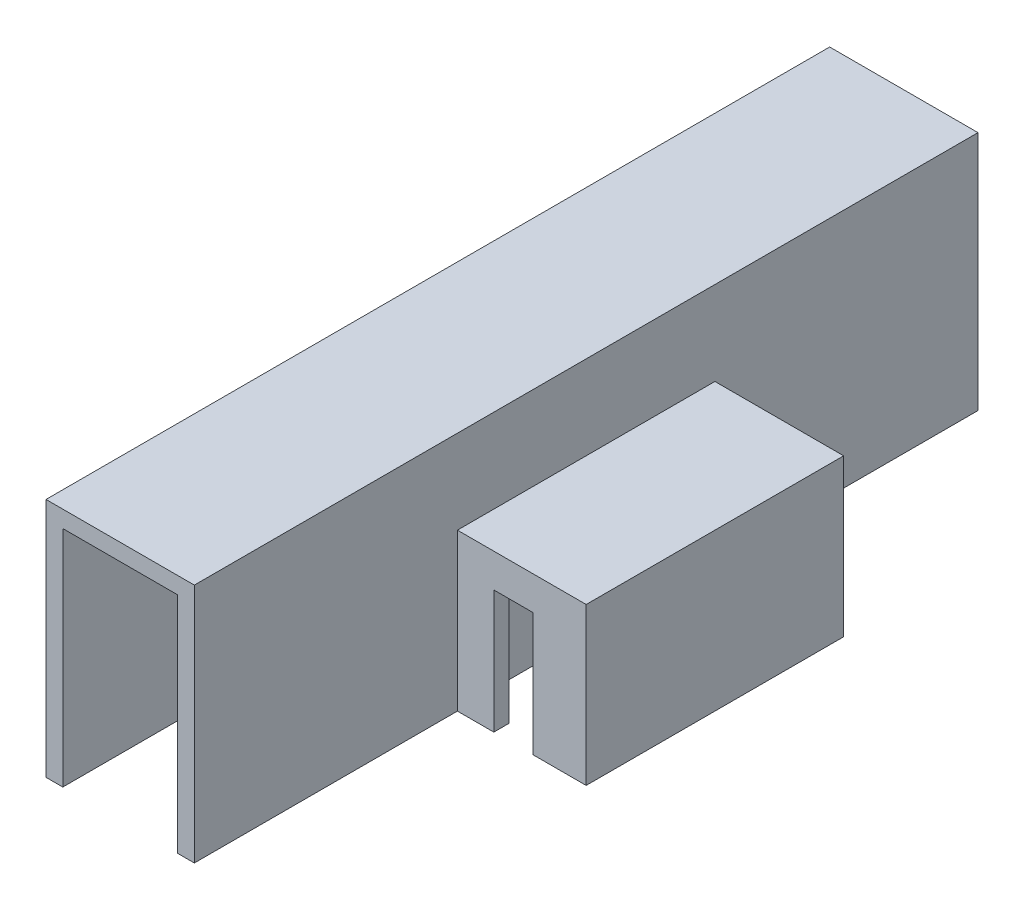
ISO-10303-21;
HEADER;
FILE_DESCRIPTION(('STEP AP214'),'2;1');
FILE_NAME('part.step','',(''),(''),'','','');
FILE_SCHEMA(('AUTOMOTIVE_DESIGN { 1 0 10303 214 1 1 1 1 }'));
ENDSEC;
DATA;
#1=APPLICATION_CONTEXT('core data for automotive mechanical design processes');
#2=APPLICATION_PROTOCOL_DEFINITION('international standard','automotive_design',2000,#1);
#3=PRODUCT_CONTEXT('',#1,'mechanical');
#4=PRODUCT('Part','Part','',(#3));
#5=PRODUCT_RELATED_PRODUCT_CATEGORY('part','',(#4));
#6=PRODUCT_DEFINITION_FORMATION('','',#4);
#7=PRODUCT_DEFINITION_CONTEXT('part definition',#1,'design');
#8=PRODUCT_DEFINITION('design','',#6,#7);
#9=PRODUCT_DEFINITION_SHAPE('','',#8);
#10=(LENGTH_UNIT() NAMED_UNIT(*) SI_UNIT(.MILLI.,.METRE.));
#11=(NAMED_UNIT(*) PLANE_ANGLE_UNIT() SI_UNIT($,.RADIAN.));
#12=(NAMED_UNIT(*) SI_UNIT($,.STERADIAN.) SOLID_ANGLE_UNIT());
#13=UNCERTAINTY_MEASURE_WITH_UNIT(LENGTH_MEASURE(1.E-05),#10,'distance_accuracy_value','');
#14=(GEOMETRIC_REPRESENTATION_CONTEXT(3) GLOBAL_UNCERTAINTY_ASSIGNED_CONTEXT((#13)) GLOBAL_UNIT_ASSIGNED_CONTEXT((#10,
#11,#12)) REPRESENTATION_CONTEXT('',''));
#15=CARTESIAN_POINT('',(0.,0.,0.));
#16=DIRECTION('',(0.,0.,1.));
#17=DIRECTION('',(1.,0.,0.));
#18=AXIS2_PLACEMENT_3D('',#15,#16,#17);
#19=CARTESIAN_POINT('',(-13.,26.,-23.));
#20=DIRECTION('',(0.,0.,1.));
#21=DIRECTION('',(1.,0.,0.));
#22=AXIS2_PLACEMENT_3D('',#19,#20,#21);
#23=PLANE('',#22);
#24=DIRECTION('',(0.,-1.,0.));
#25=VECTOR('',#24,1.);
#26=CARTESIAN_POINT('',(-9.99999999999999,0.,-23.));
#27=LINE('',#26,#25);
#28=CARTESIAN_POINT('',(-9.99999999999999,28.,-23.));
#29=VERTEX_POINT('',#28);
#30=CARTESIAN_POINT('',(-9.99999999999999,0.,-23.));
#31=VERTEX_POINT('',#30);
#32=EDGE_CURVE('E11',#29,#31,#27,.T.);
#33=ORIENTED_EDGE('',*,*,#32,.F.);
#34=DIRECTION('',(-1.,0.,0.));
#35=VECTOR('',#34,1.);
#36=CARTESIAN_POINT('',(-13.,28.,-23.));
#37=LINE('',#36,#35);
#38=CARTESIAN_POINT('',(13.,28.,-23.));
#39=VERTEX_POINT('',#38);
#40=EDGE_CURVE('E310',#39,#29,#37,.T.);
#41=ORIENTED_EDGE('',*,*,#40,.F.);
#42=DIRECTION('',(0.,-1.,0.));
#43=VECTOR('',#42,1.);
#44=CARTESIAN_POINT('',(13.,26.,-23.));
#45=LINE('',#44,#43);
#46=CARTESIAN_POINT('',(13.,0.,-23.));
#47=VERTEX_POINT('',#46);
#48=EDGE_CURVE('E382',#39,#47,#45,.T.);
#49=ORIENTED_EDGE('',*,*,#48,.T.);
#50=DIRECTION('',(-1.,0.,0.));
#51=VECTOR('',#50,1.);
#52=CARTESIAN_POINT('',(-13.,0.,-23.));
#53=LINE('',#52,#51);
#54=EDGE_CURVE('E368',#47,#31,#53,.T.);
#55=ORIENTED_EDGE('',*,*,#54,.T.);
#56=EDGE_LOOP('',(#33,#41,#49,#55));
#57=FACE_BOUND('',#56,.T.);
#58=ADVANCED_FACE('F39',(#57),#23,.F.);
#59=CARTESIAN_POINT('',(-13.,26.,23.));
#60=DIRECTION('',(0.,0.,-1.));
#61=DIRECTION('',(-1.,0.,0.));
#62=AXIS2_PLACEMENT_3D('',#59,#60,#61);
#63=PLANE('',#62);
#64=DIRECTION('',(0.,1.,0.));
#65=VECTOR('',#64,1.);
#66=CARTESIAN_POINT('',(-9.99999999999999,0.,23.));
#67=LINE('',#66,#65);
#68=CARTESIAN_POINT('',(-9.99999999999999,0.,23.));
#69=VERTEX_POINT('',#68);
#70=CARTESIAN_POINT('',(-9.99999999999999,28.,23.));
#71=VERTEX_POINT('',#70);
#72=EDGE_CURVE('E62',#69,#71,#67,.T.);
#73=ORIENTED_EDGE('',*,*,#72,.F.);
#74=DIRECTION('',(1.,0.,0.));
#75=VECTOR('',#74,1.);
#76=CARTESIAN_POINT('',(-13.,0.,23.));
#77=LINE('',#76,#75);
#78=CARTESIAN_POINT('',(-3.5,0.,23.));
#79=VERTEX_POINT('',#78);
#80=EDGE_CURVE('E375',#69,#79,#77,.T.);
#81=ORIENTED_EDGE('',*,*,#80,.T.);
#82=DIRECTION('',(0.,-1.,0.));
#83=VECTOR('',#82,1.);
#84=CARTESIAN_POINT('',(-3.5,22.,23.));
#85=LINE('',#84,#83);
#86=CARTESIAN_POINT('',(-3.5,22.,23.));
#87=VERTEX_POINT('',#86);
#88=EDGE_CURVE('E299',#87,#79,#85,.T.);
#89=ORIENTED_EDGE('',*,*,#88,.F.);
#90=DIRECTION('',(-1.,0.,0.));
#91=VECTOR('',#90,1.);
#92=CARTESIAN_POINT('',(-3.5,22.,23.));
#93=LINE('',#92,#91);
#94=CARTESIAN_POINT('',(3.5,22.,23.));
#95=VERTEX_POINT('',#94);
#96=EDGE_CURVE('E290',#95,#87,#93,.T.);
#97=ORIENTED_EDGE('',*,*,#96,.F.);
#98=DIRECTION('',(0.,-1.,0.));
#99=VECTOR('',#98,1.);
#100=CARTESIAN_POINT('',(3.5,22.,23.));
#101=LINE('',#100,#99);
#102=CARTESIAN_POINT('',(3.5,0.,23.));
#103=VERTEX_POINT('',#102);
#104=EDGE_CURVE('E294',#95,#103,#101,.T.);
#105=ORIENTED_EDGE('',*,*,#104,.T.);
#106=CARTESIAN_POINT('',(13.,0.,23.));
#107=VERTEX_POINT('',#106);
#108=EDGE_CURVE('E374',#103,#107,#77,.T.);
#109=ORIENTED_EDGE('',*,*,#108,.T.);
#110=DIRECTION('',(0.,-1.,0.));
#111=VECTOR('',#110,1.);
#112=CARTESIAN_POINT('',(13.,26.,23.));
#113=LINE('',#112,#111);
#114=CARTESIAN_POINT('',(13.,28.,23.));
#115=VERTEX_POINT('',#114);
#116=EDGE_CURVE('E378',#115,#107,#113,.T.);
#117=ORIENTED_EDGE('',*,*,#116,.F.);
#118=DIRECTION('',(1.,0.,0.));
#119=VECTOR('',#118,1.);
#120=CARTESIAN_POINT('',(-13.,28.,23.));
#121=LINE('',#120,#119);
#122=EDGE_CURVE('E314',#71,#115,#121,.T.);
#123=ORIENTED_EDGE('',*,*,#122,.F.);
#124=EDGE_LOOP('',(#73,#81,#89,#97,#105,#109,#117,#123));
#125=FACE_BOUND('',#124,.T.);
#126=ADVANCED_FACE('F412',(#125),#63,.F.);
#127=CARTESIAN_POINT('',(0.,0.,0.));
#128=DIRECTION('',(0.,1.,0.));
#129=DIRECTION('',(0.,0.,1.));
#130=AXIS2_PLACEMENT_3D('',#127,#128,#129);
#131=PLANE('',#130);
#132=DIRECTION('',(1.,0.,0.));
#133=VECTOR('',#132,1.);
#134=CARTESIAN_POINT('',(-10.25,0.,20.25));
#135=LINE('',#134,#133);
#136=CARTESIAN_POINT('',(-10.25,0.,20.25));
#137=VERTEX_POINT('',#136);
#138=CARTESIAN_POINT('',(-3.5,0.,20.25));
#139=VERTEX_POINT('',#138);
#140=EDGE_CURVE('E323',#137,#139,#135,.T.);
#141=ORIENTED_EDGE('',*,*,#140,.T.);
#142=DIRECTION('',(0.,0.,-1.));
#143=VECTOR('',#142,1.);
#144=CARTESIAN_POINT('',(-3.5,0.,23.));
#145=LINE('',#144,#143);
#146=EDGE_CURVE('E282',#79,#139,#145,.T.);
#147=ORIENTED_EDGE('',*,*,#146,.F.);
#148=ORIENTED_EDGE('',*,*,#80,.F.);
#149=DIRECTION('',(0.,0.,-1.));
#150=VECTOR('',#149,1.);
#151=CARTESIAN_POINT('',(-9.99999999999999,0.,30.));
#152=LINE('',#151,#150);
#153=CARTESIAN_POINT('',(-9.99999999999999,0.,70.));
#154=VERTEX_POINT('',#153);
#155=EDGE_CURVE('E189',#154,#69,#152,.T.);
#156=ORIENTED_EDGE('',*,*,#155,.F.);
#157=DIRECTION('',(1.,0.,0.));
#158=VECTOR('',#157,1.);
#159=CARTESIAN_POINT('',(-9.99999999999999,0.,70.));
#160=LINE('',#159,#158);
#161=CARTESIAN_POINT('',(-13.,0.,70.));
#162=VERTEX_POINT('',#161);
#163=EDGE_CURVE('E237',#162,#154,#160,.T.);
#164=ORIENTED_EDGE('',*,*,#163,.F.);
#165=DIRECTION('',(0.,0.,1.));
#166=VECTOR('',#165,1.);
#167=CARTESIAN_POINT('',(-13.,0.,-23.));
#168=LINE('',#167,#166);
#169=CARTESIAN_POINT('',(-13.,0.,-70.));
#170=VERTEX_POINT('',#169);
#171=EDGE_CURVE('E371',#170,#162,#168,.T.);
#172=ORIENTED_EDGE('',*,*,#171,.F.);
#173=DIRECTION('',(-1.,0.,0.));
#174=VECTOR('',#173,1.);
#175=CARTESIAN_POINT('',(-13.,0.,-70.));
#176=LINE('',#175,#174);
#177=CARTESIAN_POINT('',(-9.99999999999999,0.,-70.));
#178=VERTEX_POINT('',#177);
#179=EDGE_CURVE('E205',#178,#170,#176,.T.);
#180=ORIENTED_EDGE('',*,*,#179,.F.);
#181=DIRECTION('',(0.,0.,1.));
#182=VECTOR('',#181,1.);
#183=CARTESIAN_POINT('',(-9.99999999999999,0.,-30.));
#184=LINE('',#183,#182);
#185=EDGE_CURVE('E272',#178,#31,#184,.T.);
#186=ORIENTED_EDGE('',*,*,#185,.T.);
#187=ORIENTED_EDGE('',*,*,#54,.F.);
#188=DIRECTION('',(0.,0.,-1.));
#189=VECTOR('',#188,1.);
#190=CARTESIAN_POINT('',(13.,0.,-23.));
#191=LINE('',#190,#189);
#192=EDGE_CURVE('E364',#107,#47,#191,.T.);
#193=ORIENTED_EDGE('',*,*,#192,.F.);
#194=ORIENTED_EDGE('',*,*,#108,.F.);
#195=DIRECTION('',(0.,0.,1.));
#196=VECTOR('',#195,1.);
#197=CARTESIAN_POINT('',(3.5,0.,23.));
#198=LINE('',#197,#196);
#199=CARTESIAN_POINT('',(3.5,0.,20.25));
#200=VERTEX_POINT('',#199);
#201=EDGE_CURVE('E287',#200,#103,#198,.T.);
#202=ORIENTED_EDGE('',*,*,#201,.F.);
#203=CARTESIAN_POINT('',(10.25,0.,20.25));
#204=VERTEX_POINT('',#203);
#205=EDGE_CURVE('E347',#200,#204,#135,.T.);
#206=ORIENTED_EDGE('',*,*,#205,.T.);
#207=DIRECTION('',(0.,0.,-1.));
#208=VECTOR('',#207,1.);
#209=CARTESIAN_POINT('',(10.25,0.,-20.25));
#210=LINE('',#209,#208);
#211=CARTESIAN_POINT('',(10.25,0.,-20.25));
#212=VERTEX_POINT('',#211);
#213=EDGE_CURVE('E317',#204,#212,#210,.T.);
#214=ORIENTED_EDGE('',*,*,#213,.T.);
#215=DIRECTION('',(-1.,0.,0.));
#216=VECTOR('',#215,1.);
#217=CARTESIAN_POINT('',(-10.25,0.,-20.25));
#218=LINE('',#217,#216);
#219=CARTESIAN_POINT('',(-10.25,0.,-20.25));
#220=VERTEX_POINT('',#219);
#221=EDGE_CURVE('E339',#212,#220,#218,.T.);
#222=ORIENTED_EDGE('',*,*,#221,.T.);
#223=DIRECTION('',(0.,0.,1.));
#224=VECTOR('',#223,1.);
#225=CARTESIAN_POINT('',(-10.25,0.,-20.25));
#226=LINE('',#225,#224);
#227=EDGE_CURVE('E343',#220,#137,#226,.T.);
#228=ORIENTED_EDGE('',*,*,#227,.T.);
#229=EDGE_LOOP('',(#141,#147,#148,#156,#164,#172,#180,#186,#187,#193,#194,#202,#206,#214,#222,#228));
#230=FACE_BOUND('',#229,.T.);
#231=ADVANCED_FACE('F414',(#230),#131,.F.);
#232=CARTESIAN_POINT('',(13.,26.,-23.));
#233=DIRECTION('',(-1.,0.,0.));
#234=DIRECTION('',(0.,0.,1.));
#235=AXIS2_PLACEMENT_3D('',#232,#233,#234);
#236=PLANE('',#235);
#237=ORIENTED_EDGE('',*,*,#192,.T.);
#238=ORIENTED_EDGE('',*,*,#48,.F.);
#239=DIRECTION('',(0.,0.,-1.));
#240=VECTOR('',#239,1.);
#241=CARTESIAN_POINT('',(13.,28.,-23.));
#242=LINE('',#241,#240);
#243=EDGE_CURVE('E303',#115,#39,#242,.T.);
#244=ORIENTED_EDGE('',*,*,#243,.F.);
#245=ORIENTED_EDGE('',*,*,#116,.T.);
#246=EDGE_LOOP('',(#237,#238,#244,#245));
#247=FACE_BOUND('',#246,.T.);
#248=ADVANCED_FACE('F41',(#247),#236,.F.);
#249=CARTESIAN_POINT('',(-13.,26.,-23.));
#250=DIRECTION('',(1.,0.,0.));
#251=DIRECTION('',(0.,0.,-1.));
#252=AXIS2_PLACEMENT_3D('',#249,#250,#251);
#253=PLANE('',#252);
#254=ORIENTED_EDGE('',*,*,#171,.T.);
#255=DIRECTION('',(0.,-1.,0.));
#256=VECTOR('',#255,1.);
#257=CARTESIAN_POINT('',(-13.,0.,70.));
#258=LINE('',#257,#256);
#259=CARTESIAN_POINT('',(-13.,40.,70.));
#260=VERTEX_POINT('',#259);
#261=EDGE_CURVE('E184',#260,#162,#258,.T.);
#262=ORIENTED_EDGE('',*,*,#261,.F.);
#263=DIRECTION('',(0.,0.,-1.));
#264=VECTOR('',#263,1.);
#265=CARTESIAN_POINT('',(-13.,40.,30.));
#266=LINE('',#265,#264);
#267=CARTESIAN_POINT('',(-13.,40.,-70.));
#268=VERTEX_POINT('',#267);
#269=EDGE_CURVE('E178',#260,#268,#266,.T.);
#270=ORIENTED_EDGE('',*,*,#269,.T.);
#271=DIRECTION('',(0.,1.,0.));
#272=VECTOR('',#271,1.);
#273=CARTESIAN_POINT('',(-13.,40.,-70.));
#274=LINE('',#273,#272);
#275=EDGE_CURVE('E182',#170,#268,#274,.T.);
#276=ORIENTED_EDGE('',*,*,#275,.F.);
#277=EDGE_LOOP('',(#254,#262,#270,#276));
#278=FACE_BOUND('',#277,.T.);
#279=ADVANCED_FACE('F180',(#278),#253,.F.);
#280=CARTESIAN_POINT('',(10.25,26.,-20.25));
#281=DIRECTION('',(-1.,0.,0.));
#282=DIRECTION('',(0.,0.,1.));
#283=AXIS2_PLACEMENT_3D('',#280,#281,#282);
#284=PLANE('',#283);
#285=ORIENTED_EDGE('',*,*,#213,.F.);
#286=DIRECTION('',(0.,-1.,0.));
#287=VECTOR('',#286,1.);
#288=CARTESIAN_POINT('',(10.25,26.,20.25));
#289=LINE('',#288,#287);
#290=CARTESIAN_POINT('',(10.25,26.,20.25));
#291=VERTEX_POINT('',#290);
#292=EDGE_CURVE('E335',#291,#204,#289,.T.);
#293=ORIENTED_EDGE('',*,*,#292,.F.);
#294=DIRECTION('',(0.,0.,-1.));
#295=VECTOR('',#294,1.);
#296=CARTESIAN_POINT('',(10.25,26.,-20.25));
#297=LINE('',#296,#295);
#298=CARTESIAN_POINT('',(10.25,26.,-20.25));
#299=VERTEX_POINT('',#298);
#300=EDGE_CURVE('E318',#291,#299,#297,.T.);
#301=ORIENTED_EDGE('',*,*,#300,.T.);
#302=DIRECTION('',(0.,-1.,0.));
#303=VECTOR('',#302,1.);
#304=CARTESIAN_POINT('',(10.25,26.,-20.25));
#305=LINE('',#304,#303);
#306=EDGE_CURVE('E360',#299,#212,#305,.T.);
#307=ORIENTED_EDGE('',*,*,#306,.T.);
#308=EDGE_LOOP('',(#285,#293,#301,#307));
#309=FACE_BOUND('',#308,.T.);
#310=ADVANCED_FACE('F428',(#309),#284,.T.);
#311=CARTESIAN_POINT('',(-10.25,26.,-20.25));
#312=DIRECTION('',(0.,0.,1.));
#313=DIRECTION('',(1.,0.,0.));
#314=AXIS2_PLACEMENT_3D('',#311,#312,#313);
#315=PLANE('',#314);
#316=ORIENTED_EDGE('',*,*,#221,.F.);
#317=ORIENTED_EDGE('',*,*,#306,.F.);
#318=DIRECTION('',(-1.,0.,0.));
#319=VECTOR('',#318,1.);
#320=CARTESIAN_POINT('',(-10.25,26.,-20.25));
#321=LINE('',#320,#319);
#322=CARTESIAN_POINT('',(-10.25,26.,-20.25));
#323=VERTEX_POINT('',#322);
#324=EDGE_CURVE('E322',#299,#323,#321,.T.);
#325=ORIENTED_EDGE('',*,*,#324,.T.);
#326=DIRECTION('',(0.,-1.,0.));
#327=VECTOR('',#326,1.);
#328=CARTESIAN_POINT('',(-10.25,26.,-20.25));
#329=LINE('',#328,#327);
#330=EDGE_CURVE('E357',#323,#220,#329,.T.);
#331=ORIENTED_EDGE('',*,*,#330,.T.);
#332=EDGE_LOOP('',(#316,#317,#325,#331));
#333=FACE_BOUND('',#332,.T.);
#334=ADVANCED_FACE('F425',(#333),#315,.T.);
#335=CARTESIAN_POINT('',(-10.25,26.,-20.25));
#336=DIRECTION('',(1.,0.,0.));
#337=DIRECTION('',(0.,0.,-1.));
#338=AXIS2_PLACEMENT_3D('',#335,#336,#337);
#339=PLANE('',#338);
#340=ORIENTED_EDGE('',*,*,#227,.F.);
#341=ORIENTED_EDGE('',*,*,#330,.F.);
#342=DIRECTION('',(0.,0.,1.));
#343=VECTOR('',#342,1.);
#344=CARTESIAN_POINT('',(-10.25,26.,-20.25));
#345=LINE('',#344,#343);
#346=CARTESIAN_POINT('',(-10.25,26.,20.25));
#347=VERTEX_POINT('',#346);
#348=EDGE_CURVE('E327',#323,#347,#345,.T.);
#349=ORIENTED_EDGE('',*,*,#348,.T.);
#350=DIRECTION('',(0.,-1.,0.));
#351=VECTOR('',#350,1.);
#352=CARTESIAN_POINT('',(-10.25,26.,20.25));
#353=LINE('',#352,#351);
#354=EDGE_CURVE('E354',#347,#137,#353,.T.);
#355=ORIENTED_EDGE('',*,*,#354,.T.);
#356=EDGE_LOOP('',(#340,#341,#349,#355));
#357=FACE_BOUND('',#356,.T.);
#358=ADVANCED_FACE('F420',(#357),#339,.T.);
#359=CARTESIAN_POINT('',(-10.25,26.,20.25));
#360=DIRECTION('',(0.,0.,-1.));
#361=DIRECTION('',(-1.,0.,0.));
#362=AXIS2_PLACEMENT_3D('',#359,#360,#361);
#363=PLANE('',#362);
#364=DIRECTION('',(0.,1.,0.));
#365=VECTOR('',#364,1.);
#366=CARTESIAN_POINT('',(-3.5,26.,20.25));
#367=LINE('',#366,#365);
#368=CARTESIAN_POINT('',(-3.5,22.,20.25));
#369=VERTEX_POINT('',#368);
#370=EDGE_CURVE('E43',#139,#369,#367,.T.);
#371=ORIENTED_EDGE('',*,*,#370,.F.);
#372=ORIENTED_EDGE('',*,*,#140,.F.);
#373=ORIENTED_EDGE('',*,*,#354,.F.);
#374=DIRECTION('',(1.,0.,0.));
#375=VECTOR('',#374,1.);
#376=CARTESIAN_POINT('',(-10.25,26.,20.25));
#377=LINE('',#376,#375);
#378=EDGE_CURVE('E331',#347,#291,#377,.T.);
#379=ORIENTED_EDGE('',*,*,#378,.T.);
#380=ORIENTED_EDGE('',*,*,#292,.T.);
#381=ORIENTED_EDGE('',*,*,#205,.F.);
#382=DIRECTION('',(0.,-1.,0.));
#383=VECTOR('',#382,1.);
#384=CARTESIAN_POINT('',(3.5,26.,20.25));
#385=LINE('',#384,#383);
#386=CARTESIAN_POINT('',(3.5,22.,20.25));
#387=VERTEX_POINT('',#386);
#388=EDGE_CURVE('E389',#387,#200,#385,.T.);
#389=ORIENTED_EDGE('',*,*,#388,.F.);
#390=DIRECTION('',(-1.,0.,0.));
#391=VECTOR('',#390,1.);
#392=CARTESIAN_POINT('',(-10.25,22.,20.25));
#393=LINE('',#392,#391);
#394=EDGE_CURVE('E386',#387,#369,#393,.T.);
#395=ORIENTED_EDGE('',*,*,#394,.T.);
#396=EDGE_LOOP('',(#371,#372,#373,#379,#380,#381,#389,#395));
#397=FACE_BOUND('',#396,.T.);
#398=ADVANCED_FACE('F403',(#397),#363,.T.);
#399=CARTESIAN_POINT('',(0.,26.,0.));
#400=DIRECTION('',(0.,1.,0.));
#401=DIRECTION('',(0.,0.,1.));
#402=AXIS2_PLACEMENT_3D('',#399,#400,#401);
#403=PLANE('',#402);
#404=ORIENTED_EDGE('',*,*,#324,.F.);
#405=ORIENTED_EDGE('',*,*,#300,.F.);
#406=ORIENTED_EDGE('',*,*,#378,.F.);
#407=ORIENTED_EDGE('',*,*,#348,.F.);
#408=EDGE_LOOP('',(#404,#405,#406,#407));
#409=FACE_BOUND('',#408,.T.);
#410=ADVANCED_FACE('F422',(#409),#403,.F.);
#411=CARTESIAN_POINT('',(0.,28.,0.));
#412=DIRECTION('',(0.,1.,0.));
#413=DIRECTION('',(0.,0.,1.));
#414=AXIS2_PLACEMENT_3D('',#411,#412,#413);
#415=PLANE('',#414);
#416=DIRECTION('',(0.,0.,-1.));
#417=VECTOR('',#416,1.);
#418=CARTESIAN_POINT('',(-9.99999999999999,28.,23.));
#419=LINE('',#418,#417);
#420=EDGE_CURVE('E55',#71,#29,#419,.T.);
#421=ORIENTED_EDGE('',*,*,#420,.F.);
#422=ORIENTED_EDGE('',*,*,#122,.T.);
#423=ORIENTED_EDGE('',*,*,#243,.T.);
#424=ORIENTED_EDGE('',*,*,#40,.T.);
#425=EDGE_LOOP('',(#421,#422,#423,#424));
#426=FACE_BOUND('',#425,.T.);
#427=ADVANCED_FACE('F438',(#426),#415,.T.);
#428=CARTESIAN_POINT('',(-3.5,22.,23.));
#429=DIRECTION('',(-1.,0.,0.));
#430=DIRECTION('',(0.,0.,1.));
#431=AXIS2_PLACEMENT_3D('',#428,#429,#430);
#432=PLANE('',#431);
#433=ORIENTED_EDGE('',*,*,#370,.T.);
#434=DIRECTION('',(0.,0.,-1.));
#435=VECTOR('',#434,1.);
#436=CARTESIAN_POINT('',(-3.5,22.,23.));
#437=LINE('',#436,#435);
#438=EDGE_CURVE('E283',#87,#369,#437,.T.);
#439=ORIENTED_EDGE('',*,*,#438,.F.);
#440=ORIENTED_EDGE('',*,*,#88,.T.);
#441=ORIENTED_EDGE('',*,*,#146,.T.);
#442=EDGE_LOOP('',(#433,#439,#440,#441));
#443=FACE_BOUND('',#442,.T.);
#444=ADVANCED_FACE('F399',(#443),#432,.F.);
#445=CARTESIAN_POINT('',(3.5,22.,23.));
#446=DIRECTION('',(1.,0.,0.));
#447=DIRECTION('',(0.,0.,-1.));
#448=AXIS2_PLACEMENT_3D('',#445,#446,#447);
#449=PLANE('',#448);
#450=ORIENTED_EDGE('',*,*,#388,.T.);
#451=ORIENTED_EDGE('',*,*,#201,.T.);
#452=ORIENTED_EDGE('',*,*,#104,.F.);
#453=DIRECTION('',(0.,0.,1.));
#454=VECTOR('',#453,1.);
#455=CARTESIAN_POINT('',(3.5,22.,23.));
#456=LINE('',#455,#454);
#457=EDGE_CURVE('E286',#387,#95,#456,.T.);
#458=ORIENTED_EDGE('',*,*,#457,.F.);
#459=EDGE_LOOP('',(#450,#451,#452,#458));
#460=FACE_BOUND('',#459,.T.);
#461=ADVANCED_FACE('F408',(#460),#449,.F.);
#462=CARTESIAN_POINT('',(0.,22.,0.));
#463=DIRECTION('',(0.,-1.,0.));
#464=DIRECTION('',(0.,0.,-1.));
#465=AXIS2_PLACEMENT_3D('',#462,#463,#464);
#466=PLANE('',#465);
#467=ORIENTED_EDGE('',*,*,#457,.T.);
#468=ORIENTED_EDGE('',*,*,#96,.T.);
#469=ORIENTED_EDGE('',*,*,#438,.T.);
#470=ORIENTED_EDGE('',*,*,#394,.F.);
#471=EDGE_LOOP('',(#467,#468,#469,#470));
#472=FACE_BOUND('',#471,.T.);
#473=ADVANCED_FACE('F406',(#472),#466,.T.);
#474=CARTESIAN_POINT('',(-9.99999999999999,0.,30.));
#475=DIRECTION('',(-1.,0.,0.));
#476=DIRECTION('',(0.,0.,1.));
#477=AXIS2_PLACEMENT_3D('',#474,#475,#476);
#478=PLANE('',#477);
#479=ORIENTED_EDGE('',*,*,#72,.T.);
#480=ORIENTED_EDGE('',*,*,#420,.T.);
#481=ORIENTED_EDGE('',*,*,#32,.T.);
#482=ORIENTED_EDGE('',*,*,#185,.F.);
#483=DIRECTION('',(0.,-1.,0.));
#484=VECTOR('',#483,1.);
#485=CARTESIAN_POINT('',(-9.99999999999999,0.,-70.));
#486=LINE('',#485,#484);
#487=CARTESIAN_POINT('',(-9.99999999999999,43.,-70.));
#488=VERTEX_POINT('',#487);
#489=EDGE_CURVE('E223',#488,#178,#486,.T.);
#490=ORIENTED_EDGE('',*,*,#489,.F.);
#491=DIRECTION('',(0.,0.,-1.));
#492=VECTOR('',#491,1.);
#493=CARTESIAN_POINT('',(-9.99999999999999,43.,-30.));
#494=LINE('',#493,#492);
#495=CARTESIAN_POINT('',(-9.99999999999998,43.,70.));
#496=VERTEX_POINT('',#495);
#497=EDGE_CURVE('E266',#496,#488,#494,.T.);
#498=ORIENTED_EDGE('',*,*,#497,.F.);
#499=DIRECTION('',(0.,1.,0.));
#500=VECTOR('',#499,1.);
#501=CARTESIAN_POINT('',(-9.99999999999998,43.,70.));
#502=LINE('',#501,#500);
#503=EDGE_CURVE('E241',#154,#496,#502,.T.);
#504=ORIENTED_EDGE('',*,*,#503,.F.);
#505=ORIENTED_EDGE('',*,*,#155,.T.);
#506=EDGE_LOOP('',(#479,#480,#481,#482,#490,#498,#504,#505));
#507=FACE_BOUND('',#506,.T.);
#508=ADVANCED_FACE('F439',(#507),#478,.F.);
#509=CARTESIAN_POINT('',(0.,40.,0.));
#510=DIRECTION('',(0.,-1.,0.));
#511=DIRECTION('',(0.,0.,-1.));
#512=AXIS2_PLACEMENT_3D('',#509,#510,#511);
#513=PLANE('',#512);
#514=ORIENTED_EDGE('',*,*,#269,.F.);
#515=DIRECTION('',(1.,0.,0.));
#516=VECTOR('',#515,1.);
#517=CARTESIAN_POINT('',(-13.,40.,70.));
#518=LINE('',#517,#516);
#519=CARTESIAN_POINT('',(-33.5,40.,70.));
#520=VERTEX_POINT('',#519);
#521=EDGE_CURVE('E232',#520,#260,#518,.T.);
#522=ORIENTED_EDGE('',*,*,#521,.F.);
#523=DIRECTION('',(0.,0.,1.));
#524=VECTOR('',#523,1.);
#525=CARTESIAN_POINT('',(-33.5,40.,-30.));
#526=LINE('',#525,#524);
#527=CARTESIAN_POINT('',(-33.5,40.,-70.));
#528=VERTEX_POINT('',#527);
#529=EDGE_CURVE('E194',#528,#520,#526,.T.);
#530=ORIENTED_EDGE('',*,*,#529,.F.);
#531=DIRECTION('',(-1.,0.,0.));
#532=VECTOR('',#531,1.);
#533=CARTESIAN_POINT('',(-33.5,40.,-70.));
#534=LINE('',#533,#532);
#535=EDGE_CURVE('E192',#268,#528,#534,.T.);
#536=ORIENTED_EDGE('',*,*,#535,.F.);
#537=EDGE_LOOP('',(#514,#522,#530,#536));
#538=FACE_BOUND('',#537,.T.);
#539=ADVANCED_FACE('F193',(#538),#513,.T.);
#540=CARTESIAN_POINT('',(0.,43.,0.));
#541=DIRECTION('',(0.,-1.,0.));
#542=DIRECTION('',(0.,0.,-1.));
#543=AXIS2_PLACEMENT_3D('',#540,#541,#542);
#544=PLANE('',#543);
#545=ORIENTED_EDGE('',*,*,#497,.T.);
#546=DIRECTION('',(1.,0.,0.));
#547=VECTOR('',#546,1.);
#548=CARTESIAN_POINT('',(-9.99999999999999,43.,-70.));
#549=LINE('',#548,#547);
#550=CARTESIAN_POINT('',(-36.5,43.,-70.));
#551=VERTEX_POINT('',#550);
#552=EDGE_CURVE('E219',#551,#488,#549,.T.);
#553=ORIENTED_EDGE('',*,*,#552,.F.);
#554=DIRECTION('',(0.,0.,-1.));
#555=VECTOR('',#554,1.);
#556=CARTESIAN_POINT('',(-36.5,43.,-30.));
#557=LINE('',#556,#555);
#558=CARTESIAN_POINT('',(-36.5,43.,70.));
#559=VERTEX_POINT('',#558);
#560=EDGE_CURVE('E261',#559,#551,#557,.T.);
#561=ORIENTED_EDGE('',*,*,#560,.F.);
#562=DIRECTION('',(-1.,0.,0.));
#563=VECTOR('',#562,1.);
#564=CARTESIAN_POINT('',(-36.5,43.,70.));
#565=LINE('',#564,#563);
#566=EDGE_CURVE('E245',#496,#559,#565,.T.);
#567=ORIENTED_EDGE('',*,*,#566,.F.);
#568=EDGE_LOOP('',(#545,#553,#561,#567));
#569=FACE_BOUND('',#568,.T.);
#570=ADVANCED_FACE('F457',(#569),#544,.F.);
#571=CARTESIAN_POINT('',(-33.5,0.,0.));
#572=DIRECTION('',(-1.,0.,0.));
#573=DIRECTION('',(0.,0.,1.));
#574=AXIS2_PLACEMENT_3D('',#571,#572,#573);
#575=PLANE('',#574);
#576=DIRECTION('',(0.,0.,1.));
#577=VECTOR('',#576,1.);
#578=CARTESIAN_POINT('',(-33.5,0.,-30.));
#579=LINE('',#578,#577);
#580=CARTESIAN_POINT('',(-33.5,0.,-70.));
#581=VERTEX_POINT('',#580);
#582=CARTESIAN_POINT('',(-33.5,0.,70.));
#583=VERTEX_POINT('',#582);
#584=EDGE_CURVE('E257',#581,#583,#579,.T.);
#585=ORIENTED_EDGE('',*,*,#584,.F.);
#586=DIRECTION('',(0.,-1.,0.));
#587=VECTOR('',#586,1.);
#588=CARTESIAN_POINT('',(-33.5,0.,-70.));
#589=LINE('',#588,#587);
#590=EDGE_CURVE('E199',#528,#581,#589,.T.);
#591=ORIENTED_EDGE('',*,*,#590,.F.);
#592=ORIENTED_EDGE('',*,*,#529,.T.);
#593=DIRECTION('',(0.,1.,0.));
#594=VECTOR('',#593,1.);
#595=CARTESIAN_POINT('',(-33.5,40.,70.));
#596=LINE('',#595,#594);
#597=EDGE_CURVE('E228',#583,#520,#596,.T.);
#598=ORIENTED_EDGE('',*,*,#597,.F.);
#599=EDGE_LOOP('',(#585,#591,#592,#598));
#600=FACE_BOUND('',#599,.T.);
#601=ADVANCED_FACE('F448',(#600),#575,.F.);
#602=CARTESIAN_POINT('',(-36.5,0.,-30.));
#603=DIRECTION('',(0.,1.,0.));
#604=DIRECTION('',(0.,0.,1.));
#605=AXIS2_PLACEMENT_3D('',#602,#603,#604);
#606=PLANE('',#605);
#607=ORIENTED_EDGE('',*,*,#584,.T.);
#608=DIRECTION('',(1.,0.,0.));
#609=VECTOR('',#608,1.);
#610=CARTESIAN_POINT('',(-33.5,0.,70.));
#611=LINE('',#610,#609);
#612=CARTESIAN_POINT('',(-36.5,0.,70.));
#613=VERTEX_POINT('',#612);
#614=EDGE_CURVE('E253',#613,#583,#611,.T.);
#615=ORIENTED_EDGE('',*,*,#614,.F.);
#616=DIRECTION('',(0.,0.,1.));
#617=VECTOR('',#616,1.);
#618=CARTESIAN_POINT('',(-36.5,0.,-30.));
#619=LINE('',#618,#617);
#620=CARTESIAN_POINT('',(-36.5,0.,-70.));
#621=VERTEX_POINT('',#620);
#622=EDGE_CURVE('E258',#621,#613,#619,.T.);
#623=ORIENTED_EDGE('',*,*,#622,.F.);
#624=DIRECTION('',(-1.,0.,0.));
#625=VECTOR('',#624,1.);
#626=CARTESIAN_POINT('',(-36.5,0.,-70.));
#627=LINE('',#626,#625);
#628=EDGE_CURVE('E211',#581,#621,#627,.T.);
#629=ORIENTED_EDGE('',*,*,#628,.F.);
#630=EDGE_LOOP('',(#607,#615,#623,#629));
#631=FACE_BOUND('',#630,.T.);
#632=ADVANCED_FACE('F452',(#631),#606,.F.);
#633=CARTESIAN_POINT('',(-36.5,0.,0.));
#634=DIRECTION('',(-1.,0.,0.));
#635=DIRECTION('',(0.,0.,1.));
#636=AXIS2_PLACEMENT_3D('',#633,#634,#635);
#637=PLANE('',#636);
#638=ORIENTED_EDGE('',*,*,#560,.T.);
#639=DIRECTION('',(0.,1.,0.));
#640=VECTOR('',#639,1.);
#641=CARTESIAN_POINT('',(-36.5,43.,-70.));
#642=LINE('',#641,#640);
#643=EDGE_CURVE('E215',#621,#551,#642,.T.);
#644=ORIENTED_EDGE('',*,*,#643,.F.);
#645=ORIENTED_EDGE('',*,*,#622,.T.);
#646=DIRECTION('',(0.,-1.,0.));
#647=VECTOR('',#646,1.);
#648=CARTESIAN_POINT('',(-36.5,0.,70.));
#649=LINE('',#648,#647);
#650=EDGE_CURVE('E249',#559,#613,#649,.T.);
#651=ORIENTED_EDGE('',*,*,#650,.F.);
#652=EDGE_LOOP('',(#638,#644,#645,#651));
#653=FACE_BOUND('',#652,.T.);
#654=ADVANCED_FACE('F455',(#653),#637,.T.);
#655=CARTESIAN_POINT('',(0.,0.,70.));
#656=DIRECTION('',(0.,0.,-1.));
#657=DIRECTION('',(-1.,0.,0.));
#658=AXIS2_PLACEMENT_3D('',#655,#656,#657);
#659=PLANE('',#658);
#660=ORIENTED_EDGE('',*,*,#597,.T.);
#661=ORIENTED_EDGE('',*,*,#521,.T.);
#662=ORIENTED_EDGE('',*,*,#261,.T.);
#663=ORIENTED_EDGE('',*,*,#163,.T.);
#664=ORIENTED_EDGE('',*,*,#503,.T.);
#665=ORIENTED_EDGE('',*,*,#566,.T.);
#666=ORIENTED_EDGE('',*,*,#650,.T.);
#667=ORIENTED_EDGE('',*,*,#614,.T.);
#668=EDGE_LOOP('',(#660,#661,#662,#663,#664,#665,#666,#667));
#669=FACE_BOUND('',#668,.T.);
#670=ADVANCED_FACE('F443',(#669),#659,.F.);
#671=CARTESIAN_POINT('',(0.,0.,-70.));
#672=DIRECTION('',(0.,0.,1.));
#673=DIRECTION('',(1.,0.,0.));
#674=AXIS2_PLACEMENT_3D('',#671,#672,#673);
#675=PLANE('',#674);
#676=ORIENTED_EDGE('',*,*,#275,.T.);
#677=ORIENTED_EDGE('',*,*,#535,.T.);
#678=ORIENTED_EDGE('',*,*,#590,.T.);
#679=ORIENTED_EDGE('',*,*,#628,.T.);
#680=ORIENTED_EDGE('',*,*,#643,.T.);
#681=ORIENTED_EDGE('',*,*,#552,.T.);
#682=ORIENTED_EDGE('',*,*,#489,.T.);
#683=ORIENTED_EDGE('',*,*,#179,.T.);
#684=EDGE_LOOP('',(#676,#677,#678,#679,#680,#681,#682,#683));
#685=FACE_BOUND('',#684,.T.);
#686=ADVANCED_FACE('F202',(#685),#675,.F.);
#687=CLOSED_SHELL('',(#58,#126,#231,#248,#279,#310,#334,#358,#398,#410,#427,#444,#461,#473,#508,
#539,#570,#601,#632,#654,#670,#686));
#688=MANIFOLD_SOLID_BREP('B2',#687);
#689=ADVANCED_BREP_SHAPE_REPRESENTATION('',(#18,#688),#14);
#690=SHAPE_DEFINITION_REPRESENTATION(#9,#689);
ENDSEC;
END-ISO-10303-21;
